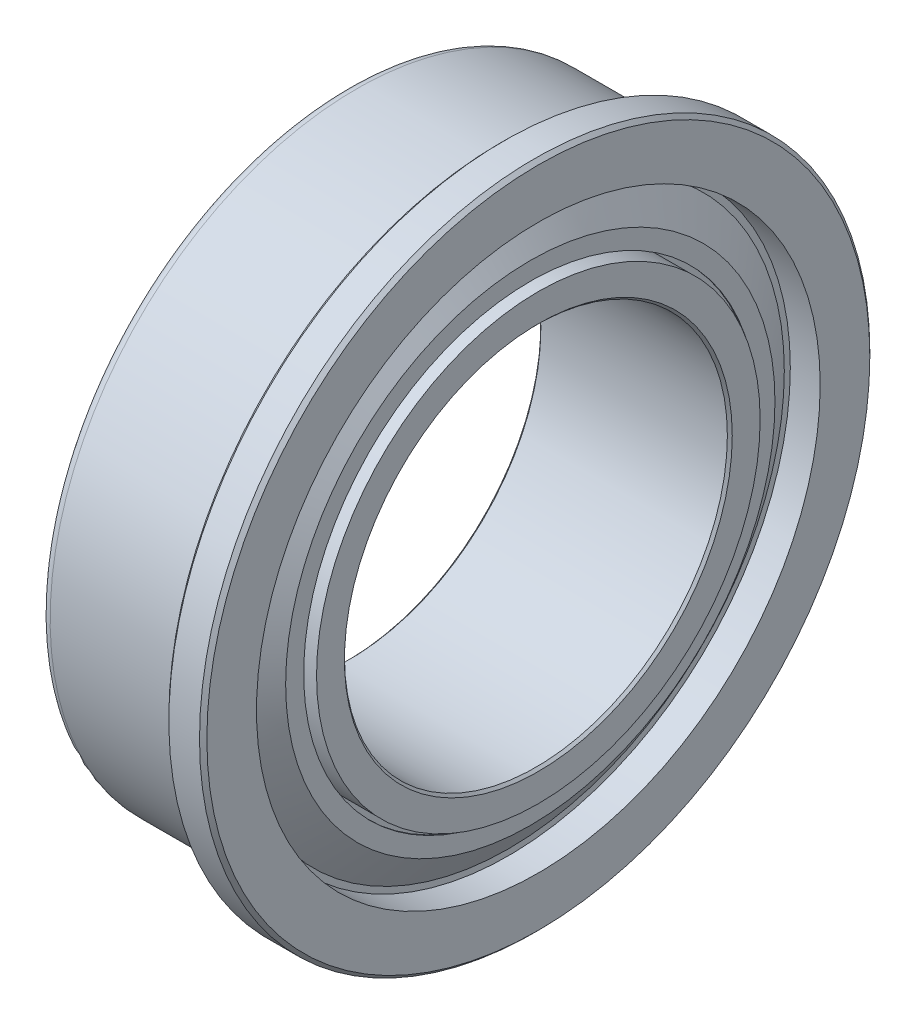
ISO-10303-21;
HEADER;
FILE_DESCRIPTION(('STEP AP214'),'2;1');
FILE_NAME('part.step','',(''),(''),'','','');
FILE_SCHEMA(('AUTOMOTIVE_DESIGN { 1 0 10303 214 1 1 1 1 }'));
ENDSEC;
DATA;
#1=APPLICATION_CONTEXT('core data for automotive mechanical design processes');
#2=APPLICATION_PROTOCOL_DEFINITION('international standard','automotive_design',2000,#1);
#3=PRODUCT_CONTEXT('',#1,'mechanical');
#4=PRODUCT('Part','Part','',(#3));
#5=PRODUCT_RELATED_PRODUCT_CATEGORY('part','',(#4));
#6=PRODUCT_DEFINITION_FORMATION('','',#4);
#7=PRODUCT_DEFINITION_CONTEXT('part definition',#1,'design');
#8=PRODUCT_DEFINITION('design','',#6,#7);
#9=PRODUCT_DEFINITION_SHAPE('','',#8);
#10=(LENGTH_UNIT() NAMED_UNIT(*) SI_UNIT(.MILLI.,.METRE.));
#11=(NAMED_UNIT(*) PLANE_ANGLE_UNIT() SI_UNIT($,.RADIAN.));
#12=(NAMED_UNIT(*) SI_UNIT($,.STERADIAN.) SOLID_ANGLE_UNIT());
#13=UNCERTAINTY_MEASURE_WITH_UNIT(LENGTH_MEASURE(1.E-05),#10,'distance_accuracy_value','');
#14=(GEOMETRIC_REPRESENTATION_CONTEXT(3) GLOBAL_UNCERTAINTY_ASSIGNED_CONTEXT((#13)) GLOBAL_UNIT_ASSIGNED_CONTEXT((#10,
#11,#12)) REPRESENTATION_CONTEXT('',''));
#15=CARTESIAN_POINT('',(0.,0.,0.));
#16=DIRECTION('',(0.,0.,1.));
#17=DIRECTION('',(1.,0.,0.));
#18=AXIS2_PLACEMENT_3D('',#15,#16,#17);
#19=CARTESIAN_POINT('',(1.98374,0.,0.));
#20=DIRECTION('',(1.,0.,0.));
#21=DIRECTION('',(0.,0.,-1.));
#22=AXIS2_PLACEMENT_3D('',#19,#20,#21);
#23=PLANE('',#22);
#24=CARTESIAN_POINT('',(1.98374000007107,0.,0.));
#25=DIRECTION('',(1.,0.,0.));
#26=DIRECTION('',(0.,0.,-1.));
#27=AXIS2_PLACEMENT_3D('',#24,#25,#26);
#28=CIRCLE('',#27,4.01955000000953);
#29=CARTESIAN_POINT('',(1.98374000007107,0.,-4.01955000000953));
#30=VERTEX_POINT('',#29);
#31=EDGE_CURVE('E183',#30,#30,#28,.F.);
#32=ORIENTED_EDGE('',*,*,#31,.T.);
#33=EDGE_LOOP('',(#32));
#34=FACE_BOUND('',#33,.T.);
#35=CARTESIAN_POINT('',(1.98374,0.,0.));
#36=DIRECTION('',(1.,0.,0.));
#37=DIRECTION('',(0.,0.,-1.));
#38=AXIS2_PLACEMENT_3D('',#35,#36,#37);
#39=CIRCLE('',#38,4.5974);
#40=CARTESIAN_POINT('',(1.98374,0.,-4.5974));
#41=VERTEX_POINT('',#40);
#42=EDGE_CURVE('E181',#41,#41,#39,.F.);
#43=ORIENTED_EDGE('',*,*,#42,.F.);
#44=EDGE_LOOP('',(#43));
#45=FACE_BOUND('',#44,.T.);
#46=ADVANCED_FACE('F15',(#34,#45),#23,.T.);
#47=CARTESIAN_POINT('',(1.98374000001422,0.,0.));
#48=DIRECTION('',(1.,0.,0.));
#49=DIRECTION('',(0.,0.,-1.));
#50=AXIS2_PLACEMENT_3D('',#47,#48,#49);
#51=CONICAL_SURFACE('',#50,4.01954999995269,0.785398163397448);
#52=ORIENTED_EDGE('',*,*,#31,.F.);
#53=EDGE_LOOP('',(#52));
#54=FACE_BOUND('',#53,.T.);
#55=CARTESIAN_POINT('',(1.93294,0.,0.));
#56=DIRECTION('',(1.,0.,0.));
#57=DIRECTION('',(0.,0.,-1.));
#58=AXIS2_PLACEMENT_3D('',#55,#56,#57);
#59=CIRCLE('',#58,3.96875);
#60=CARTESIAN_POINT('',(1.93294,0.,-3.96875));
#61=VERTEX_POINT('',#60);
#62=EDGE_CURVE('E100',#61,#61,#59,.F.);
#63=ORIENTED_EDGE('',*,*,#62,.T.);
#64=EDGE_LOOP('',(#63));
#65=FACE_BOUND('',#64,.T.);
#66=ADVANCED_FACE('F189',(#54,#65),#51,.F.);
#67=CARTESIAN_POINT('',(-2.182114,0.,0.));
#68=DIRECTION('',(1.,0.,0.));
#69=DIRECTION('',(0.,0.,-1.));
#70=AXIS2_PLACEMENT_3D('',#67,#68,#69);
#71=CYLINDRICAL_SURFACE('',#70,4.5974);
#72=CARTESIAN_POINT('',(0.99187,0.,0.));
#73=DIRECTION('',(1.,0.,0.));
#74=DIRECTION('',(0.,0.,-1.));
#75=AXIS2_PLACEMENT_3D('',#72,#73,#74);
#76=CIRCLE('',#75,4.5974);
#77=CARTESIAN_POINT('',(0.99187,0.,-4.5974));
#78=VERTEX_POINT('',#77);
#79=EDGE_CURVE('E178',#78,#78,#76,.F.);
#80=ORIENTED_EDGE('',*,*,#79,.F.);
#81=EDGE_LOOP('',(#80));
#82=FACE_BOUND('',#81,.T.);
#83=ORIENTED_EDGE('',*,*,#42,.T.);
#84=EDGE_LOOP('',(#83));
#85=FACE_BOUND('',#84,.T.);
#86=ADVANCED_FACE('F192',(#82,#85),#71,.T.);
#87=CARTESIAN_POINT('',(-2.182114,0.,0.));
#88=DIRECTION('',(1.,0.,0.));
#89=DIRECTION('',(0.,0.,-1.));
#90=AXIS2_PLACEMENT_3D('',#87,#88,#89);
#91=CYLINDRICAL_SURFACE('',#90,3.96875);
#92=ORIENTED_EDGE('',*,*,#62,.F.);
#93=EDGE_LOOP('',(#92));
#94=FACE_BOUND('',#93,.T.);
#95=CARTESIAN_POINT('',(-1.93294000007427,0.,0.));
#96=DIRECTION('',(-1.,0.,0.));
#97=DIRECTION('',(0.,1.,0.));
#98=AXIS2_PLACEMENT_3D('',#95,#96,#97);
#99=CIRCLE('',#98,3.96875000001273);
#100=CARTESIAN_POINT('',(-1.93294000007427,3.96875000001273,0.));
#101=VERTEX_POINT('',#100);
#102=EDGE_CURVE('E177',#101,#101,#99,.T.);
#103=ORIENTED_EDGE('',*,*,#102,.T.);
#104=EDGE_LOOP('',(#103));
#105=FACE_BOUND('',#104,.T.);
#106=ADVANCED_FACE('F196',(#94,#105),#91,.F.);
#107=CARTESIAN_POINT('',(0.99187,0.,0.));
#108=DIRECTION('',(1.,0.,0.));
#109=DIRECTION('',(0.,0.,-1.));
#110=AXIS2_PLACEMENT_3D('',#107,#108,#109);
#111=PLANE('',#110);
#112=ORIENTED_EDGE('',*,*,#79,.T.);
#113=EDGE_LOOP('',(#112));
#114=FACE_BOUND('',#113,.T.);
#115=CARTESIAN_POINT('',(0.99187,0.,0.));
#116=DIRECTION('',(1.,0.,0.));
#117=DIRECTION('',(0.,0.,-1.));
#118=AXIS2_PLACEMENT_3D('',#115,#116,#117);
#119=CIRCLE('',#118,5.842);
#120=CARTESIAN_POINT('',(0.99187,0.,-5.842));
#121=VERTEX_POINT('',#120);
#122=EDGE_CURVE('E174',#121,#121,#119,.T.);
#123=ORIENTED_EDGE('',*,*,#122,.T.);
#124=EDGE_LOOP('',(#123));
#125=FACE_BOUND('',#124,.T.);
#126=ADVANCED_FACE('F199',(#114,#125),#111,.T.);
#127=CARTESIAN_POINT('',(-1.98374000001422,0.,0.));
#128=DIRECTION('',(-1.,0.,0.));
#129=DIRECTION('',(0.,0.,1.));
#130=AXIS2_PLACEMENT_3D('',#127,#128,#129);
#131=CONICAL_SURFACE('',#130,4.01954999995269,0.785398163397448);
#132=ORIENTED_EDGE('',*,*,#102,.F.);
#133=EDGE_LOOP('',(#132));
#134=FACE_BOUND('',#133,.T.);
#135=CARTESIAN_POINT('',(-1.98374000007107,0.,0.));
#136=DIRECTION('',(-1.,0.,0.));
#137=DIRECTION('',(0.,0.,1.));
#138=AXIS2_PLACEMENT_3D('',#135,#136,#137);
#139=CIRCLE('',#138,4.01955000000953);
#140=CARTESIAN_POINT('',(-1.98374000007107,0.,4.01955000000953));
#141=VERTEX_POINT('',#140);
#142=EDGE_CURVE('E171',#141,#141,#139,.T.);
#143=ORIENTED_EDGE('',*,*,#142,.T.);
#144=EDGE_LOOP('',(#143));
#145=FACE_BOUND('',#144,.T.);
#146=ADVANCED_FACE('F308',(#134,#145),#131,.F.);
#147=CARTESIAN_POINT('',(-2.182114,0.,0.));
#148=DIRECTION('',(1.,0.,0.));
#149=DIRECTION('',(0.,0.,-1.));
#150=AXIS2_PLACEMENT_3D('',#147,#148,#149);
#151=CYLINDRICAL_SURFACE('',#150,5.842);
#152=ORIENTED_EDGE('',*,*,#122,.F.);
#153=EDGE_LOOP('',(#152));
#154=FACE_BOUND('',#153,.T.);
#155=CARTESIAN_POINT('',(1.3390245,0.,0.));
#156=DIRECTION('',(1.,0.,0.));
#157=DIRECTION('',(0.,0.,-1.));
#158=AXIS2_PLACEMENT_3D('',#155,#156,#157);
#159=CIRCLE('',#158,5.842);
#160=CARTESIAN_POINT('',(1.3390245,0.,-5.842));
#161=VERTEX_POINT('',#160);
#162=EDGE_CURVE('E168',#161,#161,#159,.T.);
#163=ORIENTED_EDGE('',*,*,#162,.T.);
#164=EDGE_LOOP('',(#163));
#165=FACE_BOUND('',#164,.T.);
#166=ADVANCED_FACE('F304',(#154,#165),#151,.F.);
#167=CARTESIAN_POINT('',(-1.98374,0.,0.));
#168=DIRECTION('',(1.,0.,0.));
#169=DIRECTION('',(0.,0.,-1.));
#170=AXIS2_PLACEMENT_3D('',#167,#168,#169);
#171=PLANE('',#170);
#172=ORIENTED_EDGE('',*,*,#142,.F.);
#173=EDGE_LOOP('',(#172));
#174=FACE_BOUND('',#173,.T.);
#175=CARTESIAN_POINT('',(-1.98374,0.,0.));
#176=DIRECTION('',(1.,0.,0.));
#177=DIRECTION('',(0.,0.,-1.));
#178=AXIS2_PLACEMENT_3D('',#175,#176,#177);
#179=CIRCLE('',#178,4.5974);
#180=CARTESIAN_POINT('',(-1.98374,0.,-4.5974));
#181=VERTEX_POINT('',#180);
#182=EDGE_CURVE('E165',#181,#181,#179,.T.);
#183=ORIENTED_EDGE('',*,*,#182,.F.);
#184=EDGE_LOOP('',(#183));
#185=FACE_BOUND('',#184,.T.);
#186=ADVANCED_FACE('F300',(#174,#185),#171,.F.);
#187=CARTESIAN_POINT('',(1.3390245,0.,0.));
#188=DIRECTION('',(1.,0.,0.));
#189=DIRECTION('',(0.,0.,-1.));
#190=AXIS2_PLACEMENT_3D('',#187,#188,#189);
#191=PLANE('',#190);
#192=CARTESIAN_POINT('',(1.33902449999251,0.,0.));
#193=DIRECTION('',(-1.,0.,0.));
#194=DIRECTION('',(0.,0.,1.));
#195=AXIS2_PLACEMENT_3D('',#192,#193,#194);
#196=CIRCLE('',#195,5.70953141073005);
#197=CARTESIAN_POINT('',(1.33902449999251,0.,5.70953141073005));
#198=VERTEX_POINT('',#197);
#199=EDGE_CURVE('E162',#198,#198,#196,.F.);
#200=ORIENTED_EDGE('',*,*,#199,.T.);
#201=EDGE_LOOP('',(#200));
#202=FACE_BOUND('',#201,.T.);
#203=ORIENTED_EDGE('',*,*,#162,.F.);
#204=EDGE_LOOP('',(#203));
#205=FACE_BOUND('',#204,.T.);
#206=ADVANCED_FACE('F296',(#202,#205),#191,.F.);
#207=CARTESIAN_POINT('',(-2.182114,0.,0.));
#208=DIRECTION('',(1.,0.,0.));
#209=DIRECTION('',(0.,0.,-1.));
#210=AXIS2_PLACEMENT_3D('',#207,#208,#209);
#211=CYLINDRICAL_SURFACE('',#210,4.5974);
#212=ORIENTED_EDGE('',*,*,#182,.T.);
#213=EDGE_LOOP('',(#212));
#214=FACE_BOUND('',#213,.T.);
#215=CARTESIAN_POINT('',(-0.99187,0.,0.));
#216=DIRECTION('',(1.,0.,0.));
#217=DIRECTION('',(0.,0.,-1.));
#218=AXIS2_PLACEMENT_3D('',#215,#216,#217);
#219=CIRCLE('',#218,4.5974);
#220=CARTESIAN_POINT('',(-0.99187,0.,-4.5974));
#221=VERTEX_POINT('',#220);
#222=EDGE_CURVE('E159',#221,#221,#219,.F.);
#223=ORIENTED_EDGE('',*,*,#222,.T.);
#224=EDGE_LOOP('',(#223));
#225=FACE_BOUND('',#224,.T.);
#226=ADVANCED_FACE('F292',(#214,#225),#211,.T.);
#227=CARTESIAN_POINT('',(1.33902450011192,0.,0.));
#228=DIRECTION('',(-1.,0.,0.));
#229=DIRECTION('',(0.,0.,1.));
#230=AXIS2_PLACEMENT_3D('',#227,#228,#229);
#231=CONICAL_SURFACE('',#230,5.70953141055952,0.959931088588978);
#232=ORIENTED_EDGE('',*,*,#199,.F.);
#233=EDGE_LOOP('',(#232));
#234=FACE_BOUND('',#233,.T.);
#235=CARTESIAN_POINT('',(1.79165965889749,0.,0.));
#236=DIRECTION('',(-1.,0.,0.));
#237=DIRECTION('',(0.,0.,1.));
#238=AXIS2_PLACEMENT_3D('',#235,#236,#237);
#239=CIRCLE('',#238,5.06310141076938);
#240=CARTESIAN_POINT('',(1.79165965889749,0.,5.06310141076938));
#241=VERTEX_POINT('',#240);
#242=EDGE_CURVE('E156',#241,#241,#239,.F.);
#243=ORIENTED_EDGE('',*,*,#242,.T.);
#244=EDGE_LOOP('',(#243));
#245=FACE_BOUND('',#244,.T.);
#246=ADVANCED_FACE('F288',(#234,#245),#231,.F.);
#247=CARTESIAN_POINT('',(-0.99187,0.,0.));
#248=DIRECTION('',(1.,0.,0.));
#249=DIRECTION('',(0.,0.,-1.));
#250=AXIS2_PLACEMENT_3D('',#247,#248,#249);
#251=PLANE('',#250);
#252=ORIENTED_EDGE('',*,*,#222,.F.);
#253=EDGE_LOOP('',(#252));
#254=FACE_BOUND('',#253,.T.);
#255=CARTESIAN_POINT('',(-0.99187,0.,0.));
#256=DIRECTION('',(1.,0.,0.));
#257=DIRECTION('',(0.,0.,-1.));
#258=AXIS2_PLACEMENT_3D('',#255,#256,#257);
#259=CIRCLE('',#258,5.842);
#260=CARTESIAN_POINT('',(-0.99187,0.,-5.842));
#261=VERTEX_POINT('',#260);
#262=EDGE_CURVE('E153',#261,#261,#259,.F.);
#263=ORIENTED_EDGE('',*,*,#262,.T.);
#264=EDGE_LOOP('',(#263));
#265=FACE_BOUND('',#264,.T.);
#266=ADVANCED_FACE('F284',(#254,#265),#251,.F.);
#267=CARTESIAN_POINT('',(1.79165965892498,0.,0.));
#268=DIRECTION('',(1.,0.,0.));
#269=DIRECTION('',(0.,0.,-1.));
#270=AXIS2_PLACEMENT_3D('',#267,#268,#269);
#271=PLANE('',#270);
#272=CARTESIAN_POINT('',(1.79165965892498,0.,0.));
#273=DIRECTION('',(1.,0.,0.));
#274=DIRECTION('',(0.,0.,-1.));
#275=AXIS2_PLACEMENT_3D('',#272,#273,#274);
#276=CIRCLE('',#275,4.69773);
#277=CARTESIAN_POINT('',(1.79165965892498,0.,-4.69773));
#278=VERTEX_POINT('',#277);
#279=EDGE_CURVE('E150',#278,#278,#276,.T.);
#280=ORIENTED_EDGE('',*,*,#279,.T.);
#281=EDGE_LOOP('',(#280));
#282=FACE_BOUND('',#281,.T.);
#283=ORIENTED_EDGE('',*,*,#242,.F.);
#284=EDGE_LOOP('',(#283));
#285=FACE_BOUND('',#284,.T.);
#286=ADVANCED_FACE('F280',(#282,#285),#271,.F.);
#287=CARTESIAN_POINT('',(-2.182114,0.,0.));
#288=DIRECTION('',(1.,0.,0.));
#289=DIRECTION('',(0.,0.,-1.));
#290=AXIS2_PLACEMENT_3D('',#287,#288,#289);
#291=CYLINDRICAL_SURFACE('',#290,5.842);
#292=ORIENTED_EDGE('',*,*,#262,.F.);
#293=EDGE_LOOP('',(#292));
#294=FACE_BOUND('',#293,.T.);
#295=CARTESIAN_POINT('',(-1.3390245,0.,0.));
#296=DIRECTION('',(1.,0.,0.));
#297=DIRECTION('',(0.,0.,-1.));
#298=AXIS2_PLACEMENT_3D('',#295,#296,#297);
#299=CIRCLE('',#298,5.842);
#300=CARTESIAN_POINT('',(-1.3390245,0.,-5.842));
#301=VERTEX_POINT('',#300);
#302=EDGE_CURVE('E147',#301,#301,#299,.T.);
#303=ORIENTED_EDGE('',*,*,#302,.F.);
#304=EDGE_LOOP('',(#303));
#305=FACE_BOUND('',#304,.T.);
#306=ADVANCED_FACE('F276',(#294,#305),#291,.F.);
#307=CARTESIAN_POINT('',(1.3151227420538,0.,0.));
#308=DIRECTION('',(1.,0.,0.));
#309=DIRECTION('',(0.,0.,-1.));
#310=AXIS2_PLACEMENT_3D('',#307,#308,#309);
#311=CYLINDRICAL_SURFACE('',#310,4.69773);
#312=CARTESIAN_POINT('',(1.81705965892498,0.,0.));
#313=DIRECTION('',(1.,0.,0.));
#314=DIRECTION('',(0.,0.,-1.));
#315=AXIS2_PLACEMENT_3D('',#312,#313,#314);
#316=CIRCLE('',#315,4.69773);
#317=CARTESIAN_POINT('',(1.81705965892498,0.,-4.69773));
#318=VERTEX_POINT('',#317);
#319=EDGE_CURVE('E144',#318,#318,#316,.F.);
#320=ORIENTED_EDGE('',*,*,#319,.F.);
#321=EDGE_LOOP('',(#320));
#322=FACE_BOUND('',#321,.T.);
#323=ORIENTED_EDGE('',*,*,#279,.F.);
#324=EDGE_LOOP('',(#323));
#325=FACE_BOUND('',#324,.T.);
#326=ADVANCED_FACE('F272',(#322,#325),#311,.F.);
#327=CARTESIAN_POINT('',(-1.3390245,0.,0.));
#328=DIRECTION('',(1.,0.,0.));
#329=DIRECTION('',(0.,0.,-1.));
#330=AXIS2_PLACEMENT_3D('',#327,#328,#329);
#331=PLANE('',#330);
#332=CARTESIAN_POINT('',(-1.33902449999251,0.,0.));
#333=DIRECTION('',(1.,0.,0.));
#334=DIRECTION('',(0.,0.,-1.));
#335=AXIS2_PLACEMENT_3D('',#332,#333,#334);
#336=CIRCLE('',#335,5.70953141073005);
#337=CARTESIAN_POINT('',(-1.33902449999251,0.,-5.70953141073005));
#338=VERTEX_POINT('',#337);
#339=EDGE_CURVE('E141',#338,#338,#336,.F.);
#340=ORIENTED_EDGE('',*,*,#339,.T.);
#341=EDGE_LOOP('',(#340));
#342=FACE_BOUND('',#341,.T.);
#343=ORIENTED_EDGE('',*,*,#302,.T.);
#344=EDGE_LOOP('',(#343));
#345=FACE_BOUND('',#344,.T.);
#346=ADVANCED_FACE('F268',(#342,#345),#331,.T.);
#347=CARTESIAN_POINT('',(1.81705965892498,0.,0.));
#348=DIRECTION('',(1.,0.,0.));
#349=DIRECTION('',(0.,0.,-1.));
#350=AXIS2_PLACEMENT_3D('',#347,#348,#349);
#351=PLANE('',#350);
#352=ORIENTED_EDGE('',*,*,#319,.T.);
#353=EDGE_LOOP('',(#352));
#354=FACE_BOUND('',#353,.T.);
#355=CARTESIAN_POINT('',(1.81705965895839,0.,0.));
#356=DIRECTION('',(-1.,0.,0.));
#357=DIRECTION('',(0.,0.,1.));
#358=AXIS2_PLACEMENT_3D('',#355,#356,#357);
#359=CIRCLE('',#358,5.07111000001714);
#360=CARTESIAN_POINT('',(1.81705965895839,0.,5.07111000001714));
#361=VERTEX_POINT('',#360);
#362=EDGE_CURVE('E138',#361,#361,#359,.T.);
#363=ORIENTED_EDGE('',*,*,#362,.F.);
#364=EDGE_LOOP('',(#363));
#365=FACE_BOUND('',#364,.T.);
#366=ADVANCED_FACE('F264',(#354,#365),#351,.T.);
#367=CARTESIAN_POINT('',(-1.33902450011192,0.,0.));
#368=DIRECTION('',(1.,0.,0.));
#369=DIRECTION('',(0.,0.,-1.));
#370=AXIS2_PLACEMENT_3D('',#367,#368,#369);
#371=CONICAL_SURFACE('',#370,5.70953141055952,0.959931088588978);
#372=ORIENTED_EDGE('',*,*,#339,.F.);
#373=EDGE_LOOP('',(#372));
#374=FACE_BOUND('',#373,.T.);
#375=CARTESIAN_POINT('',(-1.79165965889749,0.,0.));
#376=DIRECTION('',(1.,0.,0.));
#377=DIRECTION('',(0.,0.,-1.));
#378=AXIS2_PLACEMENT_3D('',#375,#376,#377);
#379=CIRCLE('',#378,5.06310141076938);
#380=CARTESIAN_POINT('',(-1.79165965889749,0.,-5.06310141076938));
#381=VERTEX_POINT('',#380);
#382=EDGE_CURVE('E135',#381,#381,#379,.T.);
#383=ORIENTED_EDGE('',*,*,#382,.F.);
#384=EDGE_LOOP('',(#383));
#385=FACE_BOUND('',#384,.T.);
#386=ADVANCED_FACE('F260',(#374,#385),#371,.F.);
#387=CARTESIAN_POINT('',(1.36442450019558,0.,0.));
#388=DIRECTION('',(-1.,0.,0.));
#389=DIRECTION('',(0.,0.,1.));
#390=AXIS2_PLACEMENT_3D('',#387,#388,#389);
#391=CONICAL_SURFACE('',#390,5.71753999980729,0.959931088612604);
#392=CARTESIAN_POINT('',(1.36442450007618,0.,0.));
#393=DIRECTION('',(-1.,0.,0.));
#394=DIRECTION('',(0.,0.,1.));
#395=AXIS2_PLACEMENT_3D('',#392,#393,#394);
#396=CIRCLE('',#395,5.71753999997782);
#397=CARTESIAN_POINT('',(1.36442450007618,0.,5.71753999997782));
#398=VERTEX_POINT('',#397);
#399=EDGE_CURVE('E132',#398,#398,#396,.T.);
#400=ORIENTED_EDGE('',*,*,#399,.F.);
#401=EDGE_LOOP('',(#400));
#402=FACE_BOUND('',#401,.T.);
#403=ORIENTED_EDGE('',*,*,#362,.T.);
#404=EDGE_LOOP('',(#403));
#405=FACE_BOUND('',#404,.T.);
#406=ADVANCED_FACE('F256',(#402,#405),#391,.T.);
#407=CARTESIAN_POINT('',(-1.79165965892498,0.,0.));
#408=DIRECTION('',(1.,0.,0.));
#409=DIRECTION('',(0.,0.,-1.));
#410=AXIS2_PLACEMENT_3D('',#407,#408,#409);
#411=PLANE('',#410);
#412=CARTESIAN_POINT('',(-1.79165965892498,0.,0.));
#413=DIRECTION('',(1.,0.,0.));
#414=DIRECTION('',(0.,0.,-1.));
#415=AXIS2_PLACEMENT_3D('',#412,#413,#414);
#416=CIRCLE('',#415,4.69773);
#417=CARTESIAN_POINT('',(-1.79165965892498,0.,-4.69773));
#418=VERTEX_POINT('',#417);
#419=EDGE_CURVE('E129',#418,#418,#416,.F.);
#420=ORIENTED_EDGE('',*,*,#419,.T.);
#421=EDGE_LOOP('',(#420));
#422=FACE_BOUND('',#421,.T.);
#423=ORIENTED_EDGE('',*,*,#382,.T.);
#424=EDGE_LOOP('',(#423));
#425=FACE_BOUND('',#424,.T.);
#426=ADVANCED_FACE('F252',(#422,#425),#411,.T.);
#427=CARTESIAN_POINT('',(1.3644245,0.,0.));
#428=DIRECTION('',(1.,0.,0.));
#429=DIRECTION('',(0.,0.,-1.));
#430=AXIS2_PLACEMENT_3D('',#427,#428,#429);
#431=PLANE('',#430);
#432=ORIENTED_EDGE('',*,*,#399,.T.);
#433=EDGE_LOOP('',(#432));
#434=FACE_BOUND('',#433,.T.);
#435=CARTESIAN_POINT('',(1.3644245,0.,0.));
#436=DIRECTION('',(1.,0.,0.));
#437=DIRECTION('',(0.,0.,-1.));
#438=AXIS2_PLACEMENT_3D('',#435,#436,#437);
#439=CIRCLE('',#438,5.842);
#440=CARTESIAN_POINT('',(1.3644245,0.,-5.842));
#441=VERTEX_POINT('',#440);
#442=EDGE_CURVE('E126',#441,#441,#439,.T.);
#443=ORIENTED_EDGE('',*,*,#442,.T.);
#444=EDGE_LOOP('',(#443));
#445=FACE_BOUND('',#444,.T.);
#446=ADVANCED_FACE('F248',(#434,#445),#431,.T.);
#447=CARTESIAN_POINT('',(-1.3151227420538,0.,0.));
#448=DIRECTION('',(1.,0.,0.));
#449=DIRECTION('',(0.,0.,-1.));
#450=AXIS2_PLACEMENT_3D('',#447,#448,#449);
#451=CYLINDRICAL_SURFACE('',#450,4.69773);
#452=CARTESIAN_POINT('',(-1.81705965892498,0.,0.));
#453=DIRECTION('',(1.,0.,0.));
#454=DIRECTION('',(0.,0.,-1.));
#455=AXIS2_PLACEMENT_3D('',#452,#453,#454);
#456=CIRCLE('',#455,4.69773);
#457=CARTESIAN_POINT('',(-1.81705965892498,0.,-4.69773));
#458=VERTEX_POINT('',#457);
#459=EDGE_CURVE('E123',#458,#458,#456,.F.);
#460=ORIENTED_EDGE('',*,*,#459,.T.);
#461=EDGE_LOOP('',(#460));
#462=FACE_BOUND('',#461,.T.);
#463=ORIENTED_EDGE('',*,*,#419,.F.);
#464=EDGE_LOOP('',(#463));
#465=FACE_BOUND('',#464,.T.);
#466=ADVANCED_FACE('F244',(#462,#465),#451,.F.);
#467=CARTESIAN_POINT('',(-2.182114,0.,0.));
#468=DIRECTION('',(1.,0.,0.));
#469=DIRECTION('',(0.,0.,-1.));
#470=AXIS2_PLACEMENT_3D('',#467,#468,#469);
#471=CYLINDRICAL_SURFACE('',#470,5.842);
#472=CARTESIAN_POINT('',(1.98374,0.,0.));
#473=DIRECTION('',(1.,0.,0.));
#474=DIRECTION('',(0.,0.,-1.));
#475=AXIS2_PLACEMENT_3D('',#472,#473,#474);
#476=CIRCLE('',#475,5.842);
#477=CARTESIAN_POINT('',(1.98374,0.,-5.842));
#478=VERTEX_POINT('',#477);
#479=EDGE_CURVE('E120',#478,#478,#476,.F.);
#480=ORIENTED_EDGE('',*,*,#479,.F.);
#481=EDGE_LOOP('',(#480));
#482=FACE_BOUND('',#481,.T.);
#483=ORIENTED_EDGE('',*,*,#442,.F.);
#484=EDGE_LOOP('',(#483));
#485=FACE_BOUND('',#484,.T.);
#486=ADVANCED_FACE('F240',(#482,#485),#471,.F.);
#487=CARTESIAN_POINT('',(-1.81705965892498,0.,0.));
#488=DIRECTION('',(1.,0.,0.));
#489=DIRECTION('',(0.,0.,-1.));
#490=AXIS2_PLACEMENT_3D('',#487,#488,#489);
#491=PLANE('',#490);
#492=ORIENTED_EDGE('',*,*,#459,.F.);
#493=EDGE_LOOP('',(#492));
#494=FACE_BOUND('',#493,.T.);
#495=CARTESIAN_POINT('',(-1.81705965895839,0.,0.));
#496=DIRECTION('',(1.,0.,0.));
#497=DIRECTION('',(0.,0.,-1.));
#498=AXIS2_PLACEMENT_3D('',#495,#496,#497);
#499=CIRCLE('',#498,5.07111000001714);
#500=CARTESIAN_POINT('',(-1.81705965895839,0.,-5.07111000001714));
#501=VERTEX_POINT('',#500);
#502=EDGE_CURVE('E117',#501,#501,#499,.T.);
#503=ORIENTED_EDGE('',*,*,#502,.F.);
#504=EDGE_LOOP('',(#503));
#505=FACE_BOUND('',#504,.T.);
#506=ADVANCED_FACE('F236',(#494,#505),#491,.F.);
#507=CARTESIAN_POINT('',(1.98374,0.,0.));
#508=DIRECTION('',(1.,0.,0.));
#509=DIRECTION('',(0.,0.,-1.));
#510=AXIS2_PLACEMENT_3D('',#507,#508,#509);
#511=PLANE('',#510);
#512=ORIENTED_EDGE('',*,*,#479,.T.);
#513=EDGE_LOOP('',(#512));
#514=FACE_BOUND('',#513,.T.);
#515=CARTESIAN_POINT('',(1.98374000001422,0.,0.));
#516=DIRECTION('',(-1.,0.,0.));
#517=DIRECTION('',(0.,0.,1.));
#518=AXIS2_PLACEMENT_3D('',#515,#516,#517);
#519=CIRCLE('',#518,6.87070000003587);
#520=CARTESIAN_POINT('',(1.98374000001422,0.,6.87070000003587));
#521=VERTEX_POINT('',#520);
#522=EDGE_CURVE('E114',#521,#521,#519,.T.);
#523=ORIENTED_EDGE('',*,*,#522,.F.);
#524=EDGE_LOOP('',(#523));
#525=FACE_BOUND('',#524,.T.);
#526=ADVANCED_FACE('F232',(#514,#525),#511,.T.);
#527=CARTESIAN_POINT('',(-1.36442450019558,0.,0.));
#528=DIRECTION('',(1.,0.,0.));
#529=DIRECTION('',(0.,0.,-1.));
#530=AXIS2_PLACEMENT_3D('',#527,#528,#529);
#531=CONICAL_SURFACE('',#530,5.71753999980729,0.959931088612604);
#532=CARTESIAN_POINT('',(-1.36442450007618,0.,0.));
#533=DIRECTION('',(1.,0.,0.));
#534=DIRECTION('',(0.,0.,-1.));
#535=AXIS2_PLACEMENT_3D('',#532,#533,#534);
#536=CIRCLE('',#535,5.71753999997782);
#537=CARTESIAN_POINT('',(-1.36442450007618,0.,-5.71753999997782));
#538=VERTEX_POINT('',#537);
#539=EDGE_CURVE('E111',#538,#538,#536,.F.);
#540=ORIENTED_EDGE('',*,*,#539,.T.);
#541=EDGE_LOOP('',(#540));
#542=FACE_BOUND('',#541,.T.);
#543=ORIENTED_EDGE('',*,*,#502,.T.);
#544=EDGE_LOOP('',(#543));
#545=FACE_BOUND('',#544,.T.);
#546=ADVANCED_FACE('F228',(#542,#545),#531,.T.);
#547=CARTESIAN_POINT('',(1.90754000004745,0.,0.));
#548=DIRECTION('',(-1.,0.,0.));
#549=DIRECTION('',(0.,0.,1.));
#550=AXIS2_PLACEMENT_3D('',#547,#548,#549);
#551=CONICAL_SURFACE('',#550,6.94690000000264,0.785398163397448);
#552=ORIENTED_EDGE('',*,*,#522,.T.);
#553=EDGE_LOOP('',(#552));
#554=FACE_BOUND('',#553,.T.);
#555=CARTESIAN_POINT('',(1.90754,0.,0.));
#556=DIRECTION('',(1.,0.,0.));
#557=DIRECTION('',(0.,0.,-1.));
#558=AXIS2_PLACEMENT_3D('',#555,#556,#557);
#559=CIRCLE('',#558,6.9469);
#560=CARTESIAN_POINT('',(1.90754,0.,-6.9469));
#561=VERTEX_POINT('',#560);
#562=EDGE_CURVE('E110',#561,#561,#559,.F.);
#563=ORIENTED_EDGE('',*,*,#562,.F.);
#564=EDGE_LOOP('',(#563));
#565=FACE_BOUND('',#564,.T.);
#566=ADVANCED_FACE('F222',(#554,#565),#551,.T.);
#567=CARTESIAN_POINT('',(-1.3644245,0.,0.));
#568=DIRECTION('',(1.,0.,0.));
#569=DIRECTION('',(0.,0.,-1.));
#570=AXIS2_PLACEMENT_3D('',#567,#568,#569);
#571=PLANE('',#570);
#572=ORIENTED_EDGE('',*,*,#539,.F.);
#573=EDGE_LOOP('',(#572));
#574=FACE_BOUND('',#573,.T.);
#575=CARTESIAN_POINT('',(-1.3644245,0.,0.));
#576=DIRECTION('',(1.,0.,0.));
#577=DIRECTION('',(0.,0.,-1.));
#578=AXIS2_PLACEMENT_3D('',#575,#576,#577);
#579=CIRCLE('',#578,5.842);
#580=CARTESIAN_POINT('',(-1.3644245,0.,-5.842));
#581=VERTEX_POINT('',#580);
#582=EDGE_CURVE('E107',#581,#581,#579,.F.);
#583=ORIENTED_EDGE('',*,*,#582,.T.);
#584=EDGE_LOOP('',(#583));
#585=FACE_BOUND('',#584,.T.);
#586=ADVANCED_FACE('F214',(#574,#585),#571,.F.);
#587=CARTESIAN_POINT('',(-2.182114,0.,0.));
#588=DIRECTION('',(1.,0.,0.));
#589=DIRECTION('',(0.,0.,-1.));
#590=AXIS2_PLACEMENT_3D('',#587,#588,#589);
#591=CYLINDRICAL_SURFACE('',#590,6.9469);
#592=ORIENTED_EDGE('',*,*,#562,.T.);
#593=EDGE_LOOP('',(#592));
#594=FACE_BOUND('',#593,.T.);
#595=CARTESIAN_POINT('',(1.27254000000221,0.,0.));
#596=DIRECTION('',(1.,0.,0.));
#597=DIRECTION('',(0.,-1.,0.));
#598=AXIS2_PLACEMENT_3D('',#595,#596,#597);
#599=CIRCLE('',#598,6.94690000000264);
#600=CARTESIAN_POINT('',(1.27254000000221,-6.94690000000264,0.));
#601=VERTEX_POINT('',#600);
#602=EDGE_CURVE('E106',#601,#601,#599,.F.);
#603=ORIENTED_EDGE('',*,*,#602,.F.);
#604=EDGE_LOOP('',(#603));
#605=FACE_BOUND('',#604,.T.);
#606=ADVANCED_FACE('F211',(#594,#605),#591,.T.);
#607=CARTESIAN_POINT('',(-2.182114,0.,0.));
#608=DIRECTION('',(1.,0.,0.));
#609=DIRECTION('',(0.,0.,-1.));
#610=AXIS2_PLACEMENT_3D('',#607,#608,#609);
#611=CYLINDRICAL_SURFACE('',#610,5.842);
#612=CARTESIAN_POINT('',(-1.98374,0.,0.));
#613=DIRECTION('',(1.,0.,0.));
#614=DIRECTION('',(0.,0.,-1.));
#615=AXIS2_PLACEMENT_3D('',#612,#613,#614);
#616=CIRCLE('',#615,5.842);
#617=CARTESIAN_POINT('',(-1.98374,0.,-5.842));
#618=VERTEX_POINT('',#617);
#619=EDGE_CURVE('E41',#618,#618,#616,.F.);
#620=ORIENTED_EDGE('',*,*,#619,.T.);
#621=EDGE_LOOP('',(#620));
#622=FACE_BOUND('',#621,.T.);
#623=ORIENTED_EDGE('',*,*,#582,.F.);
#624=EDGE_LOOP('',(#623));
#625=FACE_BOUND('',#624,.T.);
#626=ADVANCED_FACE('F213',(#622,#625),#611,.F.);
#627=CARTESIAN_POINT('',(1.27253999988852,0.,0.));
#628=DIRECTION('',(1.,0.,0.));
#629=DIRECTION('',(0.,0.,-1.));
#630=AXIS2_PLACEMENT_3D('',#627,#628,#629);
#631=CONICAL_SURFACE('',#630,6.94689999988896,0.785398163397448);
#632=ORIENTED_EDGE('',*,*,#602,.T.);
#633=EDGE_LOOP('',(#632));
#634=FACE_BOUND('',#633,.T.);
#635=CARTESIAN_POINT('',(1.19634000003543,0.,0.));
#636=DIRECTION('',(1.,0.,0.));
#637=DIRECTION('',(0.,0.,-1.));
#638=AXIS2_PLACEMENT_3D('',#635,#636,#637);
#639=CIRCLE('',#638,6.87070000003587);
#640=CARTESIAN_POINT('',(1.19634000003543,0.,-6.87070000003587));
#641=VERTEX_POINT('',#640);
#642=EDGE_CURVE('E40',#641,#641,#639,.T.);
#643=ORIENTED_EDGE('',*,*,#642,.T.);
#644=EDGE_LOOP('',(#643));
#645=FACE_BOUND('',#644,.T.);
#646=ADVANCED_FACE('F62',(#634,#645),#631,.T.);
#647=CARTESIAN_POINT('',(-1.98374,0.,0.));
#648=DIRECTION('',(1.,0.,0.));
#649=DIRECTION('',(0.,0.,-1.));
#650=AXIS2_PLACEMENT_3D('',#647,#648,#649);
#651=PLANE('',#650);
#652=ORIENTED_EDGE('',*,*,#619,.F.);
#653=EDGE_LOOP('',(#652));
#654=FACE_BOUND('',#653,.T.);
#655=CARTESIAN_POINT('',(-1.98374,0.,0.));
#656=DIRECTION('',(1.,0.,0.));
#657=DIRECTION('',(0.,-1.,0.));
#658=AXIS2_PLACEMENT_3D('',#655,#656,#657);
#659=CIRCLE('',#658,6.151626);
#660=CARTESIAN_POINT('',(-1.98374,-6.151626,0.));
#661=VERTEX_POINT('',#660);
#662=CARTESIAN_POINT('',(-1.98374,6.151626,0.));
#663=VERTEX_POINT('',#662);
#664=EDGE_CURVE('E38',#661,#663,#659,.T.);
#665=ORIENTED_EDGE('',*,*,#664,.F.);
#666=CARTESIAN_POINT('',(-1.98374,0.,0.));
#667=DIRECTION('',(1.,0.,0.));
#668=DIRECTION('',(0.,1.,0.));
#669=AXIS2_PLACEMENT_3D('',#666,#667,#668);
#670=CIRCLE('',#669,6.151626);
#671=EDGE_CURVE('E32',#663,#661,#670,.T.);
#672=ORIENTED_EDGE('',*,*,#671,.F.);
#673=EDGE_LOOP('',(#665,#672));
#674=FACE_BOUND('',#673,.T.);
#675=ADVANCED_FACE('F44',(#654,#674),#651,.F.);
#676=CARTESIAN_POINT('',(1.19634,0.,0.));
#677=DIRECTION('',(1.,0.,0.));
#678=DIRECTION('',(0.,0.,-1.));
#679=AXIS2_PLACEMENT_3D('',#676,#677,#678);
#680=PLANE('',#679);
#681=CARTESIAN_POINT('',(1.19634,0.,0.));
#682=DIRECTION('',(1.,0.,0.));
#683=DIRECTION('',(0.,0.,-1.));
#684=AXIS2_PLACEMENT_3D('',#681,#682,#683);
#685=CIRCLE('',#684,6.35);
#686=CARTESIAN_POINT('',(1.19634,0.,-6.35));
#687=VERTEX_POINT('',#686);
#688=EDGE_CURVE('E25',#687,#687,#685,.F.);
#689=ORIENTED_EDGE('',*,*,#688,.F.);
#690=EDGE_LOOP('',(#689));
#691=FACE_BOUND('',#690,.T.);
#692=ORIENTED_EDGE('',*,*,#642,.F.);
#693=EDGE_LOOP('',(#692));
#694=FACE_BOUND('',#693,.T.);
#695=ADVANCED_FACE('F61',(#691,#694),#680,.F.);
#696=CARTESIAN_POINT('',(-1.785366,0.,0.));
#697=DIRECTION('',(1.,0.,0.));
#698=DIRECTION('',(0.,-1.,0.));
#699=AXIS2_PLACEMENT_3D('',#696,#697,#698);
#700=TOROIDAL_SURFACE('',#699,6.151626,0.198374);
#701=ORIENTED_EDGE('',*,*,#671,.T.);
#702=ORIENTED_EDGE('',*,*,#664,.T.);
#703=EDGE_LOOP('',(#701,#702));
#704=FACE_BOUND('',#703,.T.);
#705=CARTESIAN_POINT('',(-1.785366,0.,0.));
#706=DIRECTION('',(1.,0.,0.));
#707=DIRECTION('',(0.,0.,-1.));
#708=AXIS2_PLACEMENT_3D('',#705,#706,#707);
#709=CIRCLE('',#708,6.35);
#710=CARTESIAN_POINT('',(-1.785366,0.,-6.35));
#711=VERTEX_POINT('',#710);
#712=EDGE_CURVE('E9',#711,#711,#709,.T.);
#713=ORIENTED_EDGE('',*,*,#712,.F.);
#714=EDGE_LOOP('',(#713));
#715=FACE_BOUND('',#714,.T.);
#716=ADVANCED_FACE('F36',(#704,#715),#700,.T.);
#717=CARTESIAN_POINT('',(-2.182114,0.,0.));
#718=DIRECTION('',(1.,0.,0.));
#719=DIRECTION('',(0.,0.,-1.));
#720=AXIS2_PLACEMENT_3D('',#717,#718,#719);
#721=CYLINDRICAL_SURFACE('',#720,6.35);
#722=ORIENTED_EDGE('',*,*,#712,.T.);
#723=EDGE_LOOP('',(#722));
#724=FACE_BOUND('',#723,.T.);
#725=ORIENTED_EDGE('',*,*,#688,.T.);
#726=EDGE_LOOP('',(#725));
#727=FACE_BOUND('',#726,.T.);
#728=ADVANCED_FACE('F85',(#724,#727),#721,.T.);
#729=CLOSED_SHELL('',(#46,#66,#86,#106,#126,#146,#166,#186,#206,#226,#246,#266,#286,#306,#326,
#346,#366,#386,#406,#426,#446,#466,#486,#506,#526,#546,#566,#586,#606,#626,#646,#675,#695,#716,#728));
#730=MANIFOLD_SOLID_BREP('B1',#729);
#731=ADVANCED_BREP_SHAPE_REPRESENTATION('',(#18,#730),#14);
#732=SHAPE_DEFINITION_REPRESENTATION(#9,#731);
ENDSEC;
END-ISO-10303-21;
